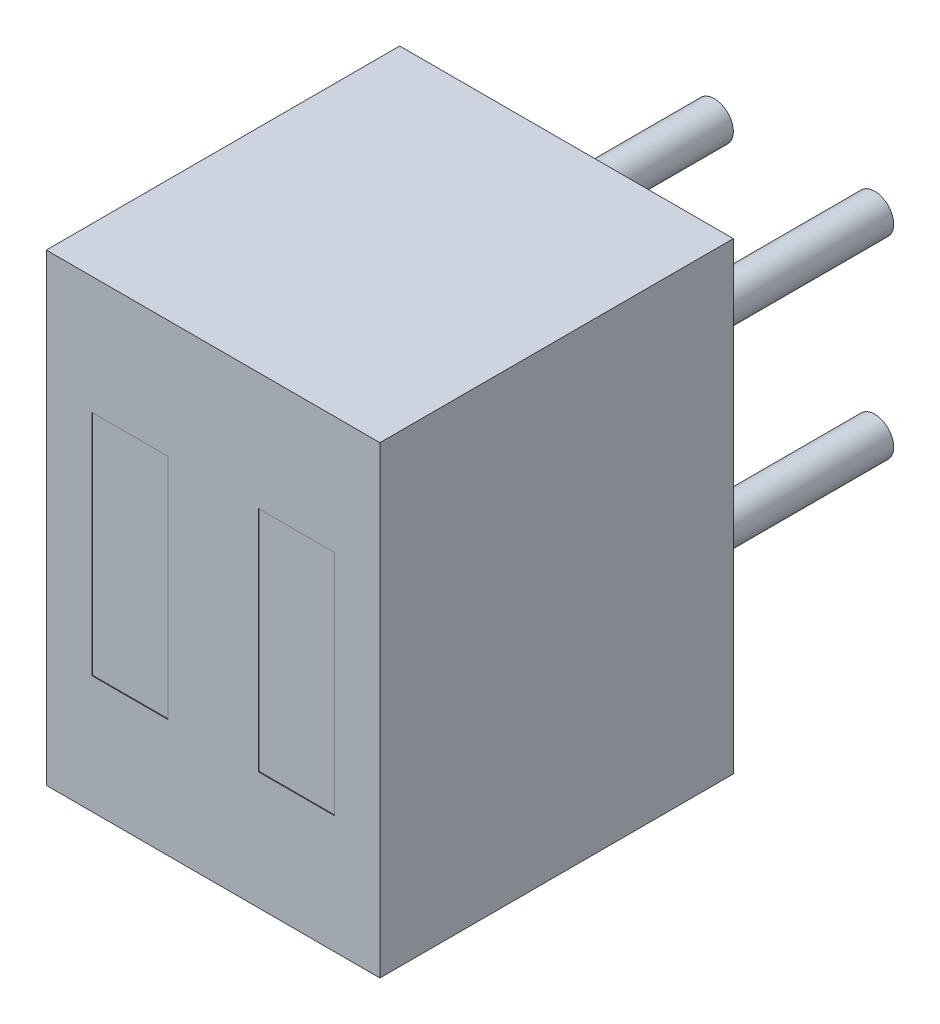
ISO-10303-21;
HEADER;
FILE_DESCRIPTION(('STEP AP214'),'2;1');
FILE_NAME('part.step','',(''),(''),'','','');
FILE_SCHEMA(('AUTOMOTIVE_DESIGN { 1 0 10303 214 1 1 1 1 }'));
ENDSEC;
DATA;
#1=APPLICATION_CONTEXT('core data for automotive mechanical design processes');
#2=APPLICATION_PROTOCOL_DEFINITION('international standard','automotive_design',2000,#1);
#3=PRODUCT_CONTEXT('',#1,'mechanical');
#4=PRODUCT('Part','Part','',(#3));
#5=PRODUCT_RELATED_PRODUCT_CATEGORY('part','',(#4));
#6=PRODUCT_DEFINITION_FORMATION('','',#4);
#7=PRODUCT_DEFINITION_CONTEXT('part definition',#1,'design');
#8=PRODUCT_DEFINITION('design','',#6,#7);
#9=PRODUCT_DEFINITION_SHAPE('','',#8);
#10=(LENGTH_UNIT() NAMED_UNIT(*) SI_UNIT(.MILLI.,.METRE.));
#11=(NAMED_UNIT(*) PLANE_ANGLE_UNIT() SI_UNIT($,.RADIAN.));
#12=(NAMED_UNIT(*) SI_UNIT($,.STERADIAN.) SOLID_ANGLE_UNIT());
#13=UNCERTAINTY_MEASURE_WITH_UNIT(LENGTH_MEASURE(1.E-05),#10,'distance_accuracy_value','');
#14=(GEOMETRIC_REPRESENTATION_CONTEXT(3) GLOBAL_UNCERTAINTY_ASSIGNED_CONTEXT((#13)) GLOBAL_UNIT_ASSIGNED_CONTEXT((#10,
#11,#12)) REPRESENTATION_CONTEXT('',''));
#15=CARTESIAN_POINT('',(0.,0.,0.));
#16=DIRECTION('',(0.,0.,1.));
#17=DIRECTION('',(1.,0.,0.));
#18=AXIS2_PLACEMENT_3D('',#15,#16,#17);
#19=CARTESIAN_POINT('',(0.,0.,4.65));
#20=DIRECTION('',(1.,0.,0.));
#21=DIRECTION('',(0.,1.,0.));
#22=AXIS2_PLACEMENT_3D('',#19,#20,#21);
#23=PLANE('',#22);
#24=DIRECTION('',(0.,-1.,0.));
#25=VECTOR('',#24,1.);
#26=CARTESIAN_POINT('',(0.,0.,0.));
#27=LINE('',#26,#25);
#28=CARTESIAN_POINT('',(0.,6.1,0.));
#29=VERTEX_POINT('',#28);
#30=CARTESIAN_POINT('',(0.,0.,0.));
#31=VERTEX_POINT('',#30);
#32=EDGE_CURVE('E166',#29,#31,#27,.T.);
#33=ORIENTED_EDGE('',*,*,#32,.T.);
#34=DIRECTION('',(0.,0.,-1.));
#35=VECTOR('',#34,1.);
#36=CARTESIAN_POINT('',(0.,0.,4.65));
#37=LINE('',#36,#35);
#38=CARTESIAN_POINT('',(0.,0.,4.65));
#39=VERTEX_POINT('',#38);
#40=EDGE_CURVE('E225',#39,#31,#37,.T.);
#41=ORIENTED_EDGE('',*,*,#40,.F.);
#42=DIRECTION('',(0.,-1.,0.));
#43=VECTOR('',#42,1.);
#44=CARTESIAN_POINT('',(0.,0.,4.65));
#45=LINE('',#44,#43);
#46=CARTESIAN_POINT('',(0.,6.1,4.65));
#47=VERTEX_POINT('',#46);
#48=EDGE_CURVE('E199',#47,#39,#45,.T.);
#49=ORIENTED_EDGE('',*,*,#48,.F.);
#50=DIRECTION('',(0.,0.,-1.));
#51=VECTOR('',#50,1.);
#52=CARTESIAN_POINT('',(0.,6.1,4.65));
#53=LINE('',#52,#51);
#54=EDGE_CURVE('E209',#47,#29,#53,.T.);
#55=ORIENTED_EDGE('',*,*,#54,.T.);
#56=EDGE_LOOP('',(#33,#41,#49,#55));
#57=FACE_BOUND('',#56,.T.);
#58=ADVANCED_FACE('F39',(#57),#23,.F.);
#59=CARTESIAN_POINT('',(0.,0.,4.65));
#60=DIRECTION('',(0.,1.,0.));
#61=DIRECTION('',(0.,0.,1.));
#62=AXIS2_PLACEMENT_3D('',#59,#60,#61);
#63=PLANE('',#62);
#64=DIRECTION('',(1.,0.,0.));
#65=VECTOR('',#64,1.);
#66=CARTESIAN_POINT('',(0.,0.,0.));
#67=LINE('',#66,#65);
#68=CARTESIAN_POINT('',(4.39,0.,0.));
#69=VERTEX_POINT('',#68);
#70=EDGE_CURVE('E212',#31,#69,#67,.T.);
#71=ORIENTED_EDGE('',*,*,#70,.T.);
#72=DIRECTION('',(0.,0.,-1.));
#73=VECTOR('',#72,1.);
#74=CARTESIAN_POINT('',(4.39,0.,4.65));
#75=LINE('',#74,#73);
#76=CARTESIAN_POINT('',(4.39,0.,4.65));
#77=VERTEX_POINT('',#76);
#78=EDGE_CURVE('E222',#77,#69,#75,.T.);
#79=ORIENTED_EDGE('',*,*,#78,.F.);
#80=DIRECTION('',(1.,0.,0.));
#81=VECTOR('',#80,1.);
#82=CARTESIAN_POINT('',(0.,0.,4.65));
#83=LINE('',#82,#81);
#84=EDGE_CURVE('E202',#39,#77,#83,.T.);
#85=ORIENTED_EDGE('',*,*,#84,.F.);
#86=ORIENTED_EDGE('',*,*,#40,.T.);
#87=EDGE_LOOP('',(#71,#79,#85,#86));
#88=FACE_BOUND('',#87,.T.);
#89=ADVANCED_FACE('F265',(#88),#63,.F.);
#90=CARTESIAN_POINT('',(4.39,0.,4.65));
#91=DIRECTION('',(-1.,0.,0.));
#92=DIRECTION('',(0.,-1.,0.));
#93=AXIS2_PLACEMENT_3D('',#90,#91,#92);
#94=PLANE('',#93);
#95=DIRECTION('',(0.,1.,0.));
#96=VECTOR('',#95,1.);
#97=CARTESIAN_POINT('',(4.39,0.,0.));
#98=LINE('',#97,#96);
#99=CARTESIAN_POINT('',(4.39,6.1,0.));
#100=VERTEX_POINT('',#99);
#101=EDGE_CURVE('E214',#69,#100,#98,.T.);
#102=ORIENTED_EDGE('',*,*,#101,.T.);
#103=DIRECTION('',(0.,0.,-1.));
#104=VECTOR('',#103,1.);
#105=CARTESIAN_POINT('',(4.39,6.1,4.65));
#106=LINE('',#105,#104);
#107=CARTESIAN_POINT('',(4.39,6.1,4.65));
#108=VERTEX_POINT('',#107);
#109=EDGE_CURVE('E219',#108,#100,#106,.T.);
#110=ORIENTED_EDGE('',*,*,#109,.F.);
#111=DIRECTION('',(0.,1.,0.));
#112=VECTOR('',#111,1.);
#113=CARTESIAN_POINT('',(4.39,0.,4.65));
#114=LINE('',#113,#112);
#115=EDGE_CURVE('E205',#77,#108,#114,.T.);
#116=ORIENTED_EDGE('',*,*,#115,.F.);
#117=ORIENTED_EDGE('',*,*,#78,.T.);
#118=EDGE_LOOP('',(#102,#110,#116,#117));
#119=FACE_BOUND('',#118,.T.);
#120=ADVANCED_FACE('F262',(#119),#94,.F.);
#121=CARTESIAN_POINT('',(0.,6.1,4.65));
#122=DIRECTION('',(0.,-1.,0.));
#123=DIRECTION('',(0.,0.,-1.));
#124=AXIS2_PLACEMENT_3D('',#121,#122,#123);
#125=PLANE('',#124);
#126=DIRECTION('',(-1.,0.,0.));
#127=VECTOR('',#126,1.);
#128=CARTESIAN_POINT('',(0.,6.1,0.));
#129=LINE('',#128,#127);
#130=EDGE_CURVE('E203',#100,#29,#129,.T.);
#131=ORIENTED_EDGE('',*,*,#130,.T.);
#132=ORIENTED_EDGE('',*,*,#54,.F.);
#133=DIRECTION('',(-1.,0.,0.));
#134=VECTOR('',#133,1.);
#135=CARTESIAN_POINT('',(0.,6.1,4.65));
#136=LINE('',#135,#134);
#137=EDGE_CURVE('E207',#108,#47,#136,.T.);
#138=ORIENTED_EDGE('',*,*,#137,.F.);
#139=ORIENTED_EDGE('',*,*,#109,.T.);
#140=EDGE_LOOP('',(#131,#132,#138,#139));
#141=FACE_BOUND('',#140,.T.);
#142=ADVANCED_FACE('F258',(#141),#125,.F.);
#143=CARTESIAN_POINT('',(0.,0.,4.65));
#144=DIRECTION('',(0.,0.,-1.));
#145=DIRECTION('',(-1.,0.,0.));
#146=AXIS2_PLACEMENT_3D('',#143,#144,#145);
#147=PLANE('',#146);
#148=DIRECTION('',(1.,0.,0.));
#149=VECTOR('',#148,1.);
#150=CARTESIAN_POINT('',(0.599999999999999,1.55,4.65));
#151=LINE('',#150,#149);
#152=CARTESIAN_POINT('',(0.599999999999999,1.55,4.65));
#153=VERTEX_POINT('',#152);
#154=CARTESIAN_POINT('',(1.6,1.55,4.65));
#155=VERTEX_POINT('',#154);
#156=EDGE_CURVE('E159',#153,#155,#151,.T.);
#157=ORIENTED_EDGE('',*,*,#156,.F.);
#158=DIRECTION('',(0.,-1.,0.));
#159=VECTOR('',#158,1.);
#160=CARTESIAN_POINT('',(0.599999999999999,1.55,4.65));
#161=LINE('',#160,#159);
#162=CARTESIAN_POINT('',(0.599999999999999,4.55,4.65));
#163=VERTEX_POINT('',#162);
#164=EDGE_CURVE('E53',#163,#153,#161,.T.);
#165=ORIENTED_EDGE('',*,*,#164,.F.);
#166=DIRECTION('',(-1.,0.,0.));
#167=VECTOR('',#166,1.);
#168=CARTESIAN_POINT('',(0.599999999999999,4.55,4.65));
#169=LINE('',#168,#167);
#170=CARTESIAN_POINT('',(1.6,4.55,4.65));
#171=VERTEX_POINT('',#170);
#172=EDGE_CURVE('E147',#171,#163,#169,.T.);
#173=ORIENTED_EDGE('',*,*,#172,.F.);
#174=DIRECTION('',(0.,1.,0.));
#175=VECTOR('',#174,1.);
#176=CARTESIAN_POINT('',(1.6,1.55,4.65));
#177=LINE('',#176,#175);
#178=EDGE_CURVE('E150',#155,#171,#177,.T.);
#179=ORIENTED_EDGE('',*,*,#178,.F.);
#180=EDGE_LOOP('',(#157,#165,#173,#179));
#181=FACE_BOUND('',#180,.T.);
#182=DIRECTION('',(1.,0.,0.));
#183=VECTOR('',#182,1.);
#184=CARTESIAN_POINT('',(2.79,1.55,4.65));
#185=LINE('',#184,#183);
#186=CARTESIAN_POINT('',(2.79,1.55,4.65));
#187=VERTEX_POINT('',#186);
#188=CARTESIAN_POINT('',(3.79,1.55,4.65));
#189=VERTEX_POINT('',#188);
#190=EDGE_CURVE('E185',#187,#189,#185,.T.);
#191=ORIENTED_EDGE('',*,*,#190,.F.);
#192=DIRECTION('',(0.,-1.,0.));
#193=VECTOR('',#192,1.);
#194=CARTESIAN_POINT('',(2.79,1.55,4.65));
#195=LINE('',#194,#193);
#196=CARTESIAN_POINT('',(2.79,4.55,4.65));
#197=VERTEX_POINT('',#196);
#198=EDGE_CURVE('E61',#197,#187,#195,.T.);
#199=ORIENTED_EDGE('',*,*,#198,.F.);
#200=DIRECTION('',(-1.,0.,0.));
#201=VECTOR('',#200,1.);
#202=CARTESIAN_POINT('',(2.79,4.55,4.65));
#203=LINE('',#202,#201);
#204=CARTESIAN_POINT('',(3.79,4.55,4.65));
#205=VERTEX_POINT('',#204);
#206=EDGE_CURVE('E174',#205,#197,#203,.T.);
#207=ORIENTED_EDGE('',*,*,#206,.F.);
#208=DIRECTION('',(0.,1.,0.));
#209=VECTOR('',#208,1.);
#210=CARTESIAN_POINT('',(3.79,1.55,4.65));
#211=LINE('',#210,#209);
#212=EDGE_CURVE('E188',#189,#205,#211,.T.);
#213=ORIENTED_EDGE('',*,*,#212,.F.);
#214=EDGE_LOOP('',(#191,#199,#207,#213));
#215=FACE_BOUND('',#214,.T.);
#216=ORIENTED_EDGE('',*,*,#48,.T.);
#217=ORIENTED_EDGE('',*,*,#84,.T.);
#218=ORIENTED_EDGE('',*,*,#115,.T.);
#219=ORIENTED_EDGE('',*,*,#137,.T.);
#220=EDGE_LOOP('',(#216,#217,#218,#219));
#221=FACE_BOUND('',#220,.T.);
#222=ADVANCED_FACE('F242',(#181,#215,#221),#147,.F.);
#223=CARTESIAN_POINT('',(0.,0.,0.));
#224=DIRECTION('',(0.,0.,-1.));
#225=DIRECTION('',(-1.,0.,0.));
#226=AXIS2_PLACEMENT_3D('',#223,#224,#225);
#227=PLANE('',#226);
#228=CARTESIAN_POINT('',(1.14,4.32,0.));
#229=DIRECTION('',(0.,0.,-1.));
#230=DIRECTION('',(-1.,0.,0.));
#231=AXIS2_PLACEMENT_3D('',#228,#229,#230);
#232=CIRCLE('',#231,0.25);
#233=CARTESIAN_POINT('',(0.889999999999999,4.32,0.));
#234=VERTEX_POINT('',#233);
#235=EDGE_CURVE('E11',#234,#234,#232,.T.);
#236=ORIENTED_EDGE('',*,*,#235,.F.);
#237=EDGE_LOOP('',(#236));
#238=FACE_BOUND('',#237,.T.);
#239=CARTESIAN_POINT('',(3.25,4.32,0.));
#240=DIRECTION('',(0.,0.,-1.));
#241=DIRECTION('',(-1.,0.,0.));
#242=AXIS2_PLACEMENT_3D('',#239,#240,#241);
#243=CIRCLE('',#242,0.250000000000001);
#244=CARTESIAN_POINT('',(3.,4.32,0.));
#245=VERTEX_POINT('',#244);
#246=EDGE_CURVE('E46',#245,#245,#243,.T.);
#247=ORIENTED_EDGE('',*,*,#246,.F.);
#248=EDGE_LOOP('',(#247));
#249=FACE_BOUND('',#248,.T.);
#250=CARTESIAN_POINT('',(3.25,1.78,0.));
#251=DIRECTION('',(0.,0.,-1.));
#252=DIRECTION('',(-1.,0.,0.));
#253=AXIS2_PLACEMENT_3D('',#250,#251,#252);
#254=CIRCLE('',#253,0.25);
#255=CARTESIAN_POINT('',(3.,1.78,0.));
#256=VERTEX_POINT('',#255);
#257=EDGE_CURVE('E231',#256,#256,#254,.T.);
#258=ORIENTED_EDGE('',*,*,#257,.F.);
#259=EDGE_LOOP('',(#258));
#260=FACE_BOUND('',#259,.T.);
#261=CARTESIAN_POINT('',(1.14,1.78,0.));
#262=DIRECTION('',(0.,0.,-1.));
#263=DIRECTION('',(-1.,0.,0.));
#264=AXIS2_PLACEMENT_3D('',#261,#262,#263);
#265=CIRCLE('',#264,0.25);
#266=CARTESIAN_POINT('',(0.889999999999999,1.78,0.));
#267=VERTEX_POINT('',#266);
#268=EDGE_CURVE('E228',#267,#267,#265,.T.);
#269=ORIENTED_EDGE('',*,*,#268,.F.);
#270=EDGE_LOOP('',(#269));
#271=FACE_BOUND('',#270,.T.);
#272=ORIENTED_EDGE('',*,*,#32,.F.);
#273=ORIENTED_EDGE('',*,*,#130,.F.);
#274=ORIENTED_EDGE('',*,*,#101,.F.);
#275=ORIENTED_EDGE('',*,*,#70,.F.);
#276=EDGE_LOOP('',(#272,#273,#274,#275));
#277=FACE_BOUND('',#276,.T.);
#278=ADVANCED_FACE('F238',(#238,#249,#260,#271,#277),#227,.T.);
#279=CARTESIAN_POINT('',(2.79,1.55,4.64));
#280=DIRECTION('',(-1.,0.,0.));
#281=DIRECTION('',(0.,0.,1.));
#282=AXIS2_PLACEMENT_3D('',#279,#280,#281);
#283=PLANE('',#282);
#284=ORIENTED_EDGE('',*,*,#198,.T.);
#285=DIRECTION('',(0.,0.,1.));
#286=VECTOR('',#285,1.);
#287=CARTESIAN_POINT('',(2.79,1.55,4.64));
#288=LINE('',#287,#286);
#289=CARTESIAN_POINT('',(2.79,1.55,4.64));
#290=VERTEX_POINT('',#289);
#291=EDGE_CURVE('E183',#290,#187,#288,.T.);
#292=ORIENTED_EDGE('',*,*,#291,.F.);
#293=DIRECTION('',(0.,-1.,0.));
#294=VECTOR('',#293,1.);
#295=CARTESIAN_POINT('',(2.79,1.55,4.64));
#296=LINE('',#295,#294);
#297=CARTESIAN_POINT('',(2.79,4.55,4.64));
#298=VERTEX_POINT('',#297);
#299=EDGE_CURVE('E170',#298,#290,#296,.T.);
#300=ORIENTED_EDGE('',*,*,#299,.F.);
#301=DIRECTION('',(0.,0.,1.));
#302=VECTOR('',#301,1.);
#303=CARTESIAN_POINT('',(2.79,4.55,4.64));
#304=LINE('',#303,#302);
#305=EDGE_CURVE('E160',#298,#197,#304,.T.);
#306=ORIENTED_EDGE('',*,*,#305,.T.);
#307=EDGE_LOOP('',(#284,#292,#300,#306));
#308=FACE_BOUND('',#307,.T.);
#309=ADVANCED_FACE('F241',(#308),#283,.F.);
#310=CARTESIAN_POINT('',(2.79,4.55,4.64));
#311=DIRECTION('',(0.,1.,0.));
#312=DIRECTION('',(0.,0.,1.));
#313=AXIS2_PLACEMENT_3D('',#310,#311,#312);
#314=PLANE('',#313);
#315=ORIENTED_EDGE('',*,*,#206,.T.);
#316=ORIENTED_EDGE('',*,*,#305,.F.);
#317=DIRECTION('',(-1.,0.,0.));
#318=VECTOR('',#317,1.);
#319=CARTESIAN_POINT('',(2.79,4.55,4.64));
#320=LINE('',#319,#318);
#321=CARTESIAN_POINT('',(3.79,4.55,4.64));
#322=VERTEX_POINT('',#321);
#323=EDGE_CURVE('E180',#322,#298,#320,.T.);
#324=ORIENTED_EDGE('',*,*,#323,.F.);
#325=DIRECTION('',(0.,0.,1.));
#326=VECTOR('',#325,1.);
#327=CARTESIAN_POINT('',(3.79,4.55,4.64));
#328=LINE('',#327,#326);
#329=EDGE_CURVE('E194',#322,#205,#328,.T.);
#330=ORIENTED_EDGE('',*,*,#329,.T.);
#331=EDGE_LOOP('',(#315,#316,#324,#330));
#332=FACE_BOUND('',#331,.T.);
#333=ADVANCED_FACE('F304',(#332),#314,.F.);
#334=CARTESIAN_POINT('',(3.79,1.55,4.64));
#335=DIRECTION('',(1.,0.,0.));
#336=DIRECTION('',(0.,0.,-1.));
#337=AXIS2_PLACEMENT_3D('',#334,#335,#336);
#338=PLANE('',#337);
#339=ORIENTED_EDGE('',*,*,#212,.T.);
#340=ORIENTED_EDGE('',*,*,#329,.F.);
#341=DIRECTION('',(0.,1.,0.));
#342=VECTOR('',#341,1.);
#343=CARTESIAN_POINT('',(3.79,1.55,4.64));
#344=LINE('',#343,#342);
#345=CARTESIAN_POINT('',(3.79,1.55,4.64));
#346=VERTEX_POINT('',#345);
#347=EDGE_CURVE('E177',#346,#322,#344,.T.);
#348=ORIENTED_EDGE('',*,*,#347,.F.);
#349=DIRECTION('',(0.,0.,1.));
#350=VECTOR('',#349,1.);
#351=CARTESIAN_POINT('',(3.79,1.55,4.64));
#352=LINE('',#351,#350);
#353=EDGE_CURVE('E196',#346,#189,#352,.T.);
#354=ORIENTED_EDGE('',*,*,#353,.T.);
#355=EDGE_LOOP('',(#339,#340,#348,#354));
#356=FACE_BOUND('',#355,.T.);
#357=ADVANCED_FACE('F312',(#356),#338,.F.);
#358=CARTESIAN_POINT('',(2.79,1.55,4.64));
#359=DIRECTION('',(0.,-1.,0.));
#360=DIRECTION('',(0.,0.,-1.));
#361=AXIS2_PLACEMENT_3D('',#358,#359,#360);
#362=PLANE('',#361);
#363=ORIENTED_EDGE('',*,*,#190,.T.);
#364=ORIENTED_EDGE('',*,*,#353,.F.);
#365=DIRECTION('',(1.,0.,0.));
#366=VECTOR('',#365,1.);
#367=CARTESIAN_POINT('',(2.79,1.55,4.64));
#368=LINE('',#367,#366);
#369=EDGE_CURVE('E173',#290,#346,#368,.T.);
#370=ORIENTED_EDGE('',*,*,#369,.F.);
#371=ORIENTED_EDGE('',*,*,#291,.T.);
#372=EDGE_LOOP('',(#363,#364,#370,#371));
#373=FACE_BOUND('',#372,.T.);
#374=ADVANCED_FACE('F322',(#373),#362,.F.);
#375=CARTESIAN_POINT('',(0.,0.,4.64));
#376=DIRECTION('',(0.,0.,-1.));
#377=DIRECTION('',(-1.,0.,0.));
#378=AXIS2_PLACEMENT_3D('',#375,#376,#377);
#379=PLANE('',#378);
#380=ORIENTED_EDGE('',*,*,#299,.T.);
#381=ORIENTED_EDGE('',*,*,#369,.T.);
#382=ORIENTED_EDGE('',*,*,#347,.T.);
#383=ORIENTED_EDGE('',*,*,#323,.T.);
#384=EDGE_LOOP('',(#380,#381,#382,#383));
#385=FACE_BOUND('',#384,.T.);
#386=ADVANCED_FACE('F332',(#385),#379,.F.);
#387=CARTESIAN_POINT('',(0.599999999999999,1.55,4.64));
#388=DIRECTION('',(-1.,0.,0.));
#389=DIRECTION('',(0.,0.,1.));
#390=AXIS2_PLACEMENT_3D('',#387,#388,#389);
#391=PLANE('',#390);
#392=ORIENTED_EDGE('',*,*,#164,.T.);
#393=DIRECTION('',(0.,0.,1.));
#394=VECTOR('',#393,1.);
#395=CARTESIAN_POINT('',(0.599999999999999,1.55,4.64));
#396=LINE('',#395,#394);
#397=CARTESIAN_POINT('',(0.599999999999999,1.55,4.64));
#398=VERTEX_POINT('',#397);
#399=EDGE_CURVE('E125',#398,#153,#396,.T.);
#400=ORIENTED_EDGE('',*,*,#399,.F.);
#401=DIRECTION('',(0.,-1.,0.));
#402=VECTOR('',#401,1.);
#403=CARTESIAN_POINT('',(0.599999999999999,1.55,4.64));
#404=LINE('',#403,#402);
#405=CARTESIAN_POINT('',(0.599999999999999,4.55,4.64));
#406=VERTEX_POINT('',#405);
#407=EDGE_CURVE('E129',#406,#398,#404,.T.);
#408=ORIENTED_EDGE('',*,*,#407,.F.);
#409=DIRECTION('',(0.,0.,1.));
#410=VECTOR('',#409,1.);
#411=CARTESIAN_POINT('',(0.599999999999999,4.55,4.64));
#412=LINE('',#411,#410);
#413=EDGE_CURVE('E164',#406,#163,#412,.T.);
#414=ORIENTED_EDGE('',*,*,#413,.T.);
#415=EDGE_LOOP('',(#392,#400,#408,#414));
#416=FACE_BOUND('',#415,.T.);
#417=ADVANCED_FACE('F127',(#416),#391,.F.);
#418=CARTESIAN_POINT('',(0.599999999999999,4.55,4.64));
#419=DIRECTION('',(0.,1.,0.));
#420=DIRECTION('',(0.,0.,1.));
#421=AXIS2_PLACEMENT_3D('',#418,#419,#420);
#422=PLANE('',#421);
#423=ORIENTED_EDGE('',*,*,#172,.T.);
#424=ORIENTED_EDGE('',*,*,#413,.F.);
#425=DIRECTION('',(-1.,0.,0.));
#426=VECTOR('',#425,1.);
#427=CARTESIAN_POINT('',(0.599999999999999,4.55,4.64));
#428=LINE('',#427,#426);
#429=CARTESIAN_POINT('',(1.6,4.55,4.64));
#430=VERTEX_POINT('',#429);
#431=EDGE_CURVE('E135',#430,#406,#428,.T.);
#432=ORIENTED_EDGE('',*,*,#431,.F.);
#433=DIRECTION('',(0.,0.,1.));
#434=VECTOR('',#433,1.);
#435=CARTESIAN_POINT('',(1.6,4.55,4.64));
#436=LINE('',#435,#434);
#437=EDGE_CURVE('E167',#430,#171,#436,.T.);
#438=ORIENTED_EDGE('',*,*,#437,.T.);
#439=EDGE_LOOP('',(#423,#424,#432,#438));
#440=FACE_BOUND('',#439,.T.);
#441=ADVANCED_FACE('F353',(#440),#422,.F.);
#442=CARTESIAN_POINT('',(1.6,1.55,4.64));
#443=DIRECTION('',(1.,0.,0.));
#444=DIRECTION('',(0.,0.,-1.));
#445=AXIS2_PLACEMENT_3D('',#442,#443,#444);
#446=PLANE('',#445);
#447=ORIENTED_EDGE('',*,*,#178,.T.);
#448=ORIENTED_EDGE('',*,*,#437,.F.);
#449=DIRECTION('',(0.,1.,0.));
#450=VECTOR('',#449,1.);
#451=CARTESIAN_POINT('',(1.6,1.55,4.64));
#452=LINE('',#451,#450);
#453=CARTESIAN_POINT('',(1.6,1.55,4.64));
#454=VERTEX_POINT('',#453);
#455=EDGE_CURVE('E143',#454,#430,#452,.T.);
#456=ORIENTED_EDGE('',*,*,#455,.F.);
#457=DIRECTION('',(0.,0.,1.));
#458=VECTOR('',#457,1.);
#459=CARTESIAN_POINT('',(1.6,1.55,4.64));
#460=LINE('',#459,#458);
#461=EDGE_CURVE('E134',#454,#155,#460,.T.);
#462=ORIENTED_EDGE('',*,*,#461,.T.);
#463=EDGE_LOOP('',(#447,#448,#456,#462));
#464=FACE_BOUND('',#463,.T.);
#465=ADVANCED_FACE('F362',(#464),#446,.F.);
#466=CARTESIAN_POINT('',(0.599999999999999,1.55,4.64));
#467=DIRECTION('',(0.,-1.,0.));
#468=DIRECTION('',(0.,0.,-1.));
#469=AXIS2_PLACEMENT_3D('',#466,#467,#468);
#470=PLANE('',#469);
#471=ORIENTED_EDGE('',*,*,#156,.T.);
#472=ORIENTED_EDGE('',*,*,#461,.F.);
#473=DIRECTION('',(1.,0.,0.));
#474=VECTOR('',#473,1.);
#475=CARTESIAN_POINT('',(0.599999999999999,1.55,4.64));
#476=LINE('',#475,#474);
#477=EDGE_CURVE('E138',#398,#454,#476,.T.);
#478=ORIENTED_EDGE('',*,*,#477,.F.);
#479=ORIENTED_EDGE('',*,*,#399,.T.);
#480=EDGE_LOOP('',(#471,#472,#478,#479));
#481=FACE_BOUND('',#480,.T.);
#482=ADVANCED_FACE('F139',(#481),#470,.F.);
#483=CARTESIAN_POINT('',(0.,0.,4.64));
#484=DIRECTION('',(0.,0.,-1.));
#485=DIRECTION('',(-1.,0.,0.));
#486=AXIS2_PLACEMENT_3D('',#483,#484,#485);
#487=PLANE('',#486);
#488=ORIENTED_EDGE('',*,*,#407,.T.);
#489=ORIENTED_EDGE('',*,*,#477,.T.);
#490=ORIENTED_EDGE('',*,*,#455,.T.);
#491=ORIENTED_EDGE('',*,*,#431,.T.);
#492=EDGE_LOOP('',(#488,#489,#490,#491));
#493=FACE_BOUND('',#492,.T.);
#494=ADVANCED_FACE('F145',(#493),#487,.F.);
#495=CARTESIAN_POINT('',(1.14,1.78,-3.));
#496=DIRECTION('',(0.,0.,1.));
#497=DIRECTION('',(1.,0.,0.));
#498=AXIS2_PLACEMENT_3D('',#495,#496,#497);
#499=CYLINDRICAL_SURFACE('',#498,0.25);
#500=CARTESIAN_POINT('',(1.14,1.78,-3.));
#501=DIRECTION('',(0.,0.,1.));
#502=DIRECTION('',(1.,0.,0.));
#503=AXIS2_PLACEMENT_3D('',#500,#501,#502);
#504=CIRCLE('',#503,0.25);
#505=CARTESIAN_POINT('',(1.39,1.78,-3.));
#506=VERTEX_POINT('',#505);
#507=EDGE_CURVE('E153',#506,#506,#504,.T.);
#508=ORIENTED_EDGE('',*,*,#507,.T.);
#509=EDGE_LOOP('',(#508));
#510=FACE_BOUND('',#509,.T.);
#511=ORIENTED_EDGE('',*,*,#268,.T.);
#512=EDGE_LOOP('',(#511));
#513=FACE_BOUND('',#512,.T.);
#514=ADVANCED_FACE('F389',(#510,#513),#499,.T.);
#515=CARTESIAN_POINT('',(1.14,1.78,-3.));
#516=DIRECTION('',(0.,0.,1.));
#517=DIRECTION('',(1.,0.,0.));
#518=AXIS2_PLACEMENT_3D('',#515,#516,#517);
#519=PLANE('',#518);
#520=ORIENTED_EDGE('',*,*,#507,.F.);
#521=EDGE_LOOP('',(#520));
#522=FACE_BOUND('',#521,.T.);
#523=ADVANCED_FACE('F403',(#522),#519,.F.);
#524=CARTESIAN_POINT('',(3.25,1.78,-3.));
#525=DIRECTION('',(0.,0.,1.));
#526=DIRECTION('',(1.,0.,0.));
#527=AXIS2_PLACEMENT_3D('',#524,#525,#526);
#528=CYLINDRICAL_SURFACE('',#527,0.25);
#529=CARTESIAN_POINT('',(3.25,1.78,-3.));
#530=DIRECTION('',(0.,0.,1.));
#531=DIRECTION('',(1.,0.,0.));
#532=AXIS2_PLACEMENT_3D('',#529,#530,#531);
#533=CIRCLE('',#532,0.25);
#534=CARTESIAN_POINT('',(3.5,1.78,-3.));
#535=VERTEX_POINT('',#534);
#536=EDGE_CURVE('E482',#535,#535,#533,.T.);
#537=ORIENTED_EDGE('',*,*,#536,.T.);
#538=EDGE_LOOP('',(#537));
#539=FACE_BOUND('',#538,.T.);
#540=ORIENTED_EDGE('',*,*,#257,.T.);
#541=EDGE_LOOP('',(#540));
#542=FACE_BOUND('',#541,.T.);
#543=ADVANCED_FACE('F413',(#539,#542),#528,.T.);
#544=CARTESIAN_POINT('',(3.25,1.78,-3.));
#545=DIRECTION('',(0.,0.,1.));
#546=DIRECTION('',(1.,0.,0.));
#547=AXIS2_PLACEMENT_3D('',#544,#545,#546);
#548=PLANE('',#547);
#549=ORIENTED_EDGE('',*,*,#536,.F.);
#550=EDGE_LOOP('',(#549));
#551=FACE_BOUND('',#550,.T.);
#552=ADVANCED_FACE('F423',(#551),#548,.F.);
#553=CARTESIAN_POINT('',(3.25,4.32,-3.));
#554=DIRECTION('',(0.,0.,1.));
#555=DIRECTION('',(1.,0.,0.));
#556=AXIS2_PLACEMENT_3D('',#553,#554,#555);
#557=CYLINDRICAL_SURFACE('',#556,0.250000000000001);
#558=CARTESIAN_POINT('',(3.25,4.32,-3.));
#559=DIRECTION('',(0.,0.,1.));
#560=DIRECTION('',(1.,0.,0.));
#561=AXIS2_PLACEMENT_3D('',#558,#559,#560);
#562=CIRCLE('',#561,0.250000000000001);
#563=CARTESIAN_POINT('',(3.5,4.32,-3.));
#564=VERTEX_POINT('',#563);
#565=EDGE_CURVE('E479',#564,#564,#562,.T.);
#566=ORIENTED_EDGE('',*,*,#565,.T.);
#567=EDGE_LOOP('',(#566));
#568=FACE_BOUND('',#567,.T.);
#569=ORIENTED_EDGE('',*,*,#246,.T.);
#570=EDGE_LOOP('',(#569));
#571=FACE_BOUND('',#570,.T.);
#572=ADVANCED_FACE('F236',(#568,#571),#557,.T.);
#573=CARTESIAN_POINT('',(3.25,4.32,-3.));
#574=DIRECTION('',(0.,0.,1.));
#575=DIRECTION('',(1.,0.,0.));
#576=AXIS2_PLACEMENT_3D('',#573,#574,#575);
#577=PLANE('',#576);
#578=ORIENTED_EDGE('',*,*,#565,.F.);
#579=EDGE_LOOP('',(#578));
#580=FACE_BOUND('',#579,.T.);
#581=ADVANCED_FACE('F442',(#580),#577,.F.);
#582=CARTESIAN_POINT('',(1.14,4.32,-3.));
#583=DIRECTION('',(0.,0.,1.));
#584=DIRECTION('',(1.,0.,0.));
#585=AXIS2_PLACEMENT_3D('',#582,#583,#584);
#586=CYLINDRICAL_SURFACE('',#585,0.25);
#587=CARTESIAN_POINT('',(1.14,4.32,-3.));
#588=DIRECTION('',(0.,0.,1.));
#589=DIRECTION('',(1.,0.,0.));
#590=AXIS2_PLACEMENT_3D('',#587,#588,#589);
#591=CIRCLE('',#590,0.25);
#592=CARTESIAN_POINT('',(1.39,4.32,-3.));
#593=VERTEX_POINT('',#592);
#594=EDGE_CURVE('E478',#593,#593,#591,.T.);
#595=ORIENTED_EDGE('',*,*,#594,.T.);
#596=EDGE_LOOP('',(#595));
#597=FACE_BOUND('',#596,.T.);
#598=ORIENTED_EDGE('',*,*,#235,.T.);
#599=EDGE_LOOP('',(#598));
#600=FACE_BOUND('',#599,.T.);
#601=ADVANCED_FACE('F452',(#597,#600),#586,.T.);
#602=CARTESIAN_POINT('',(1.14,4.32,-3.));
#603=DIRECTION('',(0.,0.,1.));
#604=DIRECTION('',(1.,0.,0.));
#605=AXIS2_PLACEMENT_3D('',#602,#603,#604);
#606=PLANE('',#605);
#607=ORIENTED_EDGE('',*,*,#594,.F.);
#608=EDGE_LOOP('',(#607));
#609=FACE_BOUND('',#608,.T.);
#610=ADVANCED_FACE('F462',(#609),#606,.F.);
#611=CLOSED_SHELL('',(#58,#89,#120,#142,#222,#278,#309,#333,#357,#374,#386,#417,#441,#465,#482,
#494,#514,#523,#543,#552,#572,#581,#601,#610));
#612=MANIFOLD_SOLID_BREP('B2',#611);
#613=ADVANCED_BREP_SHAPE_REPRESENTATION('',(#18,#612),#14);
#614=SHAPE_DEFINITION_REPRESENTATION(#9,#613);
ENDSEC;
END-ISO-10303-21;
